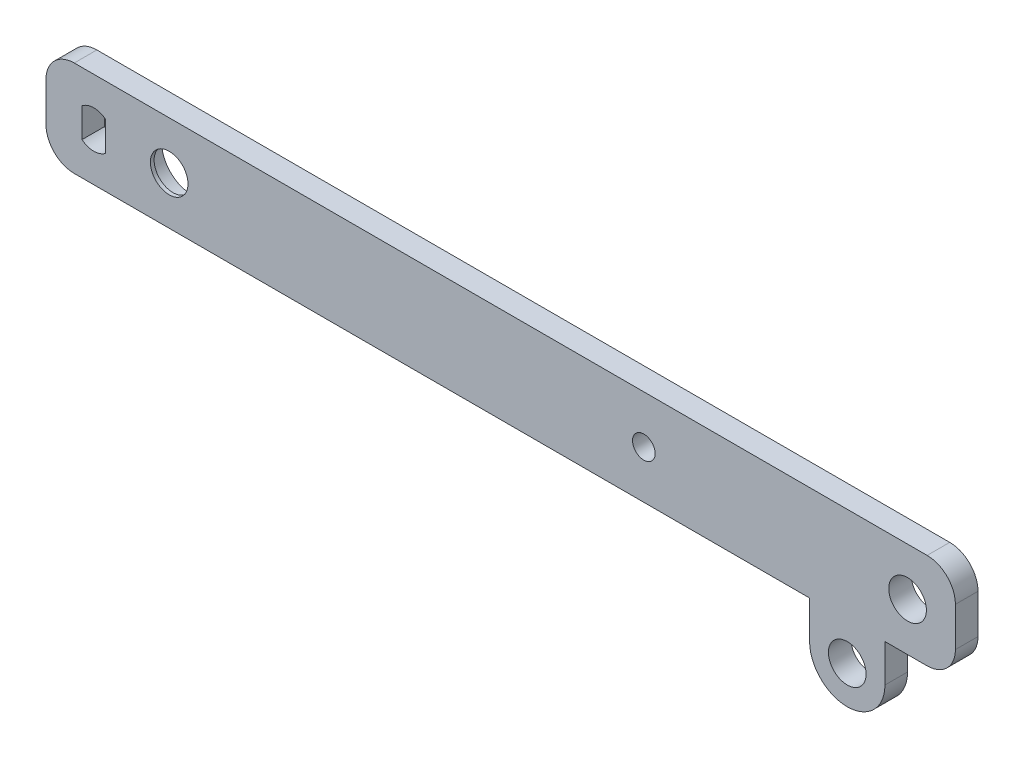
ISO-10303-21;
HEADER;
FILE_DESCRIPTION(('STEP AP214'),'2;1');
FILE_NAME('part.step','',(''),(''),'','','');
FILE_SCHEMA(('AUTOMOTIVE_DESIGN { 1 0 10303 214 1 1 1 1 }'));
ENDSEC;
DATA;
#1=APPLICATION_CONTEXT('core data for automotive mechanical design processes');
#2=APPLICATION_PROTOCOL_DEFINITION('international standard','automotive_design',2000,#1);
#3=PRODUCT_CONTEXT('',#1,'mechanical');
#4=PRODUCT('Part','Part','',(#3));
#5=PRODUCT_RELATED_PRODUCT_CATEGORY('part','',(#4));
#6=PRODUCT_DEFINITION_FORMATION('','',#4);
#7=PRODUCT_DEFINITION_CONTEXT('part definition',#1,'design');
#8=PRODUCT_DEFINITION('design','',#6,#7);
#9=PRODUCT_DEFINITION_SHAPE('','',#8);
#10=(LENGTH_UNIT() NAMED_UNIT(*) SI_UNIT(.MILLI.,.METRE.));
#11=(NAMED_UNIT(*) PLANE_ANGLE_UNIT() SI_UNIT($,.RADIAN.));
#12=(NAMED_UNIT(*) SI_UNIT($,.STERADIAN.) SOLID_ANGLE_UNIT());
#13=UNCERTAINTY_MEASURE_WITH_UNIT(LENGTH_MEASURE(1.E-05),#10,'distance_accuracy_value','');
#14=(GEOMETRIC_REPRESENTATION_CONTEXT(3) GLOBAL_UNCERTAINTY_ASSIGNED_CONTEXT((#13)) GLOBAL_UNIT_ASSIGNED_CONTEXT((#10,
#11,#12)) REPRESENTATION_CONTEXT('',''));
#15=CARTESIAN_POINT('',(0.,0.,0.));
#16=DIRECTION('',(0.,0.,1.));
#17=DIRECTION('',(1.,0.,0.));
#18=AXIS2_PLACEMENT_3D('',#15,#16,#17);
#19=CARTESIAN_POINT('',(40.,0.,12.));
#20=DIRECTION('',(0.,0.,-1.));
#21=DIRECTION('',(-1.,0.,0.));
#22=AXIS2_PLACEMENT_3D('',#19,#20,#21);
#23=CYLINDRICAL_SURFACE('',#22,10.);
#24=CARTESIAN_POINT('',(40.,0.,12.));
#25=DIRECTION('',(0.,0.,1.));
#26=DIRECTION('',(1.,0.,0.));
#27=AXIS2_PLACEMENT_3D('',#24,#25,#26);
#28=CIRCLE('',#27,10.);
#29=CARTESIAN_POINT('',(50.,0.,12.));
#30=VERTEX_POINT('',#29);
#31=EDGE_CURVE('E185',#30,#30,#28,.T.);
#32=ORIENTED_EDGE('',*,*,#31,.T.);
#33=EDGE_LOOP('',(#32));
#34=FACE_BOUND('',#33,.T.);
#35=CARTESIAN_POINT('',(40.,0.,10.));
#36=DIRECTION('',(0.,0.,-1.));
#37=DIRECTION('',(-1.,0.,0.));
#38=AXIS2_PLACEMENT_3D('',#35,#36,#37);
#39=CIRCLE('',#38,10.);
#40=CARTESIAN_POINT('',(30.,0.,10.));
#41=VERTEX_POINT('',#40);
#42=EDGE_CURVE('E249',#41,#41,#39,.T.);
#43=ORIENTED_EDGE('',*,*,#42,.T.);
#44=EDGE_LOOP('',(#43));
#45=FACE_BOUND('',#44,.T.);
#46=ADVANCED_FACE('F34',(#34,#45),#23,.F.);
#47=CARTESIAN_POINT('',(400.,-45.4,12.));
#48=DIRECTION('',(0.,0.,1.));
#49=DIRECTION('',(1.,0.,0.));
#50=AXIS2_PLACEMENT_3D('',#47,#48,#49);
#51=PLANE('',#50);
#52=CARTESIAN_POINT('',(292.,0.,12.));
#53=DIRECTION('',(0.,0.,1.));
#54=DIRECTION('',(1.,0.,0.));
#55=AXIS2_PLACEMENT_3D('',#52,#53,#54);
#56=CIRCLE('',#55,5.99999999999999);
#57=CARTESIAN_POINT('',(298.,0.,12.));
#58=VERTEX_POINT('',#57);
#59=EDGE_CURVE('E579',#58,#58,#56,.T.);
#60=ORIENTED_EDGE('',*,*,#59,.F.);
#61=EDGE_LOOP('',(#60));
#62=FACE_BOUND('',#61,.T.);
#63=DIRECTION('',(0.,-1.,0.));
#64=VECTOR('',#63,1.);
#65=CARTESIAN_POINT('',(-6.28,-7.7821333835909,12.));
#66=LINE('',#65,#64);
#67=CARTESIAN_POINT('',(-6.28,7.7821333835909,12.));
#68=VERTEX_POINT('',#67);
#69=CARTESIAN_POINT('',(-6.28000000000001,-7.7821333835909,12.));
#70=VERTEX_POINT('',#69);
#71=EDGE_CURVE('E161',#68,#70,#66,.T.);
#72=ORIENTED_EDGE('',*,*,#71,.F.);
#73=CARTESIAN_POINT('',(0.,0.,12.));
#74=DIRECTION('',(0.,0.,1.));
#75=DIRECTION('',(1.,0.,0.));
#76=AXIS2_PLACEMENT_3D('',#73,#74,#75);
#77=CIRCLE('',#76,10.);
#78=CARTESIAN_POINT('',(6.28,7.7821333835909,12.));
#79=VERTEX_POINT('',#78);
#80=EDGE_CURVE('E151',#79,#68,#77,.T.);
#81=ORIENTED_EDGE('',*,*,#80,.F.);
#82=DIRECTION('',(0.,1.,0.));
#83=VECTOR('',#82,1.);
#84=CARTESIAN_POINT('',(6.28,-7.7821333835909,12.));
#85=LINE('',#84,#83);
#86=CARTESIAN_POINT('',(6.28000000000001,-7.7821333835909,12.));
#87=VERTEX_POINT('',#86);
#88=EDGE_CURVE('E178',#87,#79,#85,.T.);
#89=ORIENTED_EDGE('',*,*,#88,.F.);
#90=CARTESIAN_POINT('',(0.,0.,12.));
#91=DIRECTION('',(0.,0.,1.));
#92=DIRECTION('',(1.,0.,0.));
#93=AXIS2_PLACEMENT_3D('',#90,#91,#92);
#94=CIRCLE('',#93,10.);
#95=EDGE_CURVE('E176',#70,#87,#94,.T.);
#96=ORIENTED_EDGE('',*,*,#95,.F.);
#97=EDGE_LOOP('',(#72,#81,#89,#96));
#98=FACE_BOUND('',#97,.T.);
#99=CARTESIAN_POINT('',(432.,0.,12.));
#100=DIRECTION('',(0.,0.,1.));
#101=DIRECTION('',(1.,0.,0.));
#102=AXIS2_PLACEMENT_3D('',#99,#100,#101);
#103=CIRCLE('',#102,10.);
#104=CARTESIAN_POINT('',(442.,0.,12.));
#105=VERTEX_POINT('',#104);
#106=EDGE_CURVE('E196',#105,#105,#103,.T.);
#107=ORIENTED_EDGE('',*,*,#106,.F.);
#108=EDGE_LOOP('',(#107));
#109=FACE_BOUND('',#108,.T.);
#110=DIRECTION('',(1.,0.,0.));
#111=VECTOR('',#110,1.);
#112=CARTESIAN_POINT('',(420.,-25.4,12.));
#113=LINE('',#112,#111);
#114=CARTESIAN_POINT('',(420.,-25.4,12.));
#115=VERTEX_POINT('',#114);
#116=CARTESIAN_POINT('',(442.4,-25.4,12.));
#117=VERTEX_POINT('',#116);
#118=EDGE_CURVE('E214',#115,#117,#113,.T.);
#119=ORIENTED_EDGE('',*,*,#118,.T.);
#120=CARTESIAN_POINT('',(442.4,-10.4,12.));
#121=DIRECTION('',(0.,0.,1.));
#122=DIRECTION('',(1.,0.,0.));
#123=AXIS2_PLACEMENT_3D('',#120,#121,#122);
#124=CIRCLE('',#123,15.);
#125=CARTESIAN_POINT('',(457.4,-10.4,12.));
#126=VERTEX_POINT('',#125);
#127=EDGE_CURVE('E42',#117,#126,#124,.T.);
#128=ORIENTED_EDGE('',*,*,#127,.T.);
#129=DIRECTION('',(0.,1.,0.));
#130=VECTOR('',#129,1.);
#131=CARTESIAN_POINT('',(457.4,25.4,12.));
#132=LINE('',#131,#130);
#133=CARTESIAN_POINT('',(457.4,10.4,12.));
#134=VERTEX_POINT('',#133);
#135=EDGE_CURVE('E216',#126,#134,#132,.T.);
#136=ORIENTED_EDGE('',*,*,#135,.T.);
#137=CARTESIAN_POINT('',(442.4,10.4,12.));
#138=DIRECTION('',(0.,0.,1.));
#139=DIRECTION('',(1.,0.,0.));
#140=AXIS2_PLACEMENT_3D('',#137,#138,#139);
#141=CIRCLE('',#140,15.);
#142=CARTESIAN_POINT('',(442.4,25.4,12.));
#143=VERTEX_POINT('',#142);
#144=EDGE_CURVE('E49',#134,#143,#141,.T.);
#145=ORIENTED_EDGE('',*,*,#144,.T.);
#146=DIRECTION('',(-1.,0.,0.));
#147=VECTOR('',#146,1.);
#148=CARTESIAN_POINT('',(-25.4,25.4,12.));
#149=LINE('',#148,#147);
#150=CARTESIAN_POINT('',(-10.4,25.4,12.));
#151=VERTEX_POINT('',#150);
#152=EDGE_CURVE('E218',#143,#151,#149,.T.);
#153=ORIENTED_EDGE('',*,*,#152,.T.);
#154=CARTESIAN_POINT('',(-10.4,10.4,12.));
#155=DIRECTION('',(0.,0.,1.));
#156=DIRECTION('',(1.,0.,0.));
#157=AXIS2_PLACEMENT_3D('',#154,#155,#156);
#158=CIRCLE('',#157,15.);
#159=CARTESIAN_POINT('',(-25.4,10.4,12.));
#160=VERTEX_POINT('',#159);
#161=EDGE_CURVE('E266',#151,#160,#158,.T.);
#162=ORIENTED_EDGE('',*,*,#161,.T.);
#163=DIRECTION('',(0.,-1.,0.));
#164=VECTOR('',#163,1.);
#165=CARTESIAN_POINT('',(-25.4,25.4,12.));
#166=LINE('',#165,#164);
#167=CARTESIAN_POINT('',(-25.4,-10.4,12.));
#168=VERTEX_POINT('',#167);
#169=EDGE_CURVE('E202',#160,#168,#166,.T.);
#170=ORIENTED_EDGE('',*,*,#169,.T.);
#171=CARTESIAN_POINT('',(-10.4,-10.4,12.));
#172=DIRECTION('',(0.,0.,1.));
#173=DIRECTION('',(1.,0.,0.));
#174=AXIS2_PLACEMENT_3D('',#171,#172,#173);
#175=CIRCLE('',#174,15.);
#176=CARTESIAN_POINT('',(-10.4,-25.4,12.));
#177=VERTEX_POINT('',#176);
#178=EDGE_CURVE('E268',#168,#177,#175,.T.);
#179=ORIENTED_EDGE('',*,*,#178,.T.);
#180=DIRECTION('',(1.,0.,0.));
#181=VECTOR('',#180,1.);
#182=CARTESIAN_POINT('',(-25.4,-25.4,12.));
#183=LINE('',#182,#181);
#184=CARTESIAN_POINT('',(380.,-25.4,12.));
#185=VERTEX_POINT('',#184);
#186=EDGE_CURVE('E205',#177,#185,#183,.T.);
#187=ORIENTED_EDGE('',*,*,#186,.T.);
#188=DIRECTION('',(0.,-1.,0.));
#189=VECTOR('',#188,1.);
#190=CARTESIAN_POINT('',(380.,-45.4,12.));
#191=LINE('',#190,#189);
#192=CARTESIAN_POINT('',(380.,-45.4,12.));
#193=VERTEX_POINT('',#192);
#194=EDGE_CURVE('E208',#185,#193,#191,.T.);
#195=ORIENTED_EDGE('',*,*,#194,.T.);
#196=CARTESIAN_POINT('',(400.,-45.4,12.));
#197=DIRECTION('',(0.,0.,1.));
#198=DIRECTION('',(1.,0.,0.));
#199=AXIS2_PLACEMENT_3D('',#196,#197,#198);
#200=CIRCLE('',#199,20.);
#201=CARTESIAN_POINT('',(420.,-45.4,12.));
#202=VERTEX_POINT('',#201);
#203=EDGE_CURVE('E210',#193,#202,#200,.T.);
#204=ORIENTED_EDGE('',*,*,#203,.T.);
#205=DIRECTION('',(0.,1.,0.));
#206=VECTOR('',#205,1.);
#207=CARTESIAN_POINT('',(420.,-45.4,12.));
#208=LINE('',#207,#206);
#209=EDGE_CURVE('E212',#202,#115,#208,.T.);
#210=ORIENTED_EDGE('',*,*,#209,.T.);
#211=EDGE_LOOP('',(#119,#128,#136,#145,#153,#162,#170,#179,#187,#195,#204,#210));
#212=FACE_BOUND('',#211,.T.);
#213=ORIENTED_EDGE('',*,*,#31,.F.);
#214=EDGE_LOOP('',(#213));
#215=FACE_BOUND('',#214,.T.);
#216=CARTESIAN_POINT('',(400.,-45.4,12.));
#217=DIRECTION('',(0.,0.,1.));
#218=DIRECTION('',(1.,0.,0.));
#219=AXIS2_PLACEMENT_3D('',#216,#217,#218);
#220=CIRCLE('',#219,9.99999999999998);
#221=CARTESIAN_POINT('',(410.,-45.4,12.));
#222=VERTEX_POINT('',#221);
#223=EDGE_CURVE('E573',#222,#222,#220,.T.);
#224=ORIENTED_EDGE('',*,*,#223,.F.);
#225=EDGE_LOOP('',(#224));
#226=FACE_BOUND('',#225,.T.);
#227=ADVANCED_FACE('F173',(#62,#98,#109,#212,#215,#226),#51,.T.);
#228=CARTESIAN_POINT('',(400.,-45.4,0.));
#229=DIRECTION('',(0.,0.,1.));
#230=DIRECTION('',(1.,0.,0.));
#231=AXIS2_PLACEMENT_3D('',#228,#229,#230);
#232=PLANE('',#231);
#233=CARTESIAN_POINT('',(40.,0.,0.));
#234=DIRECTION('',(0.,0.,-1.));
#235=DIRECTION('',(-1.,0.,0.));
#236=AXIS2_PLACEMENT_3D('',#233,#234,#235);
#237=CIRCLE('',#236,16.);
#238=CARTESIAN_POINT('',(24.,0.,0.));
#239=VERTEX_POINT('',#238);
#240=EDGE_CURVE('E562',#239,#239,#237,.T.);
#241=ORIENTED_EDGE('',*,*,#240,.F.);
#242=EDGE_LOOP('',(#241));
#243=FACE_BOUND('',#242,.T.);
#244=CARTESIAN_POINT('',(66.4370013321474,-11.2982209536767,0.));
#245=DIRECTION('',(0.,0.,-1.));
#246=DIRECTION('',(-1.,0.,0.));
#247=AXIS2_PLACEMENT_3D('',#244,#245,#246);
#248=CIRCLE('',#247,2.14495620677024);
#249=CARTESIAN_POINT('',(64.2920451253771,-11.2982209536767,0.));
#250=VERTEX_POINT('',#249);
#251=EDGE_CURVE('E252',#250,#250,#248,.T.);
#252=ORIENTED_EDGE('',*,*,#251,.F.);
#253=EDGE_LOOP('',(#252));
#254=FACE_BOUND('',#253,.T.);
#255=CARTESIAN_POINT('',(432.,0.,0.));
#256=DIRECTION('',(0.,0.,1.));
#257=DIRECTION('',(1.,0.,0.));
#258=AXIS2_PLACEMENT_3D('',#255,#256,#257);
#259=CIRCLE('',#258,10.);
#260=CARTESIAN_POINT('',(442.,0.,0.));
#261=VERTEX_POINT('',#260);
#262=EDGE_CURVE('E169',#261,#261,#259,.T.);
#263=ORIENTED_EDGE('',*,*,#262,.T.);
#264=EDGE_LOOP('',(#263));
#265=FACE_BOUND('',#264,.T.);
#266=DIRECTION('',(0.,1.,0.));
#267=VECTOR('',#266,1.);
#268=CARTESIAN_POINT('',(457.4,25.4,0.));
#269=LINE('',#268,#267);
#270=CARTESIAN_POINT('',(457.4,-10.4,0.));
#271=VERTEX_POINT('',#270);
#272=CARTESIAN_POINT('',(457.4,10.4,0.));
#273=VERTEX_POINT('',#272);
#274=EDGE_CURVE('E233',#271,#273,#269,.T.);
#275=ORIENTED_EDGE('',*,*,#274,.F.);
#276=CARTESIAN_POINT('',(442.4,-10.4,0.));
#277=DIRECTION('',(0.,0.,1.));
#278=DIRECTION('',(1.,0.,0.));
#279=AXIS2_PLACEMENT_3D('',#276,#277,#278);
#280=CIRCLE('',#279,15.);
#281=CARTESIAN_POINT('',(442.4,-25.4,0.));
#282=VERTEX_POINT('',#281);
#283=EDGE_CURVE('E280',#271,#282,#280,.F.);
#284=ORIENTED_EDGE('',*,*,#283,.T.);
#285=DIRECTION('',(1.,0.,0.));
#286=VECTOR('',#285,1.);
#287=CARTESIAN_POINT('',(420.,-25.4,0.));
#288=LINE('',#287,#286);
#289=CARTESIAN_POINT('',(420.,-25.4,0.));
#290=VERTEX_POINT('',#289);
#291=EDGE_CURVE('E231',#290,#282,#288,.T.);
#292=ORIENTED_EDGE('',*,*,#291,.F.);
#293=DIRECTION('',(0.,1.,0.));
#294=VECTOR('',#293,1.);
#295=CARTESIAN_POINT('',(420.,-45.4,0.));
#296=LINE('',#295,#294);
#297=CARTESIAN_POINT('',(420.,-45.4,0.));
#298=VERTEX_POINT('',#297);
#299=EDGE_CURVE('E229',#298,#290,#296,.T.);
#300=ORIENTED_EDGE('',*,*,#299,.F.);
#301=CARTESIAN_POINT('',(400.,-45.4,0.));
#302=DIRECTION('',(0.,0.,1.));
#303=DIRECTION('',(1.,0.,0.));
#304=AXIS2_PLACEMENT_3D('',#301,#302,#303);
#305=CIRCLE('',#304,20.);
#306=CARTESIAN_POINT('',(380.,-45.4,0.));
#307=VERTEX_POINT('',#306);
#308=EDGE_CURVE('E227',#307,#298,#305,.T.);
#309=ORIENTED_EDGE('',*,*,#308,.F.);
#310=DIRECTION('',(0.,-1.,0.));
#311=VECTOR('',#310,1.);
#312=CARTESIAN_POINT('',(380.,-45.4,0.));
#313=LINE('',#312,#311);
#314=CARTESIAN_POINT('',(380.,-25.4,0.));
#315=VERTEX_POINT('',#314);
#316=EDGE_CURVE('E225',#315,#307,#313,.T.);
#317=ORIENTED_EDGE('',*,*,#316,.F.);
#318=DIRECTION('',(1.,0.,0.));
#319=VECTOR('',#318,1.);
#320=CARTESIAN_POINT('',(-25.4,-25.4,0.));
#321=LINE('',#320,#319);
#322=CARTESIAN_POINT('',(-10.4,-25.4,0.));
#323=VERTEX_POINT('',#322);
#324=EDGE_CURVE('E223',#323,#315,#321,.T.);
#325=ORIENTED_EDGE('',*,*,#324,.F.);
#326=CARTESIAN_POINT('',(-10.4,-10.4,0.));
#327=DIRECTION('',(0.,0.,1.));
#328=DIRECTION('',(1.,0.,0.));
#329=AXIS2_PLACEMENT_3D('',#326,#327,#328);
#330=CIRCLE('',#329,15.);
#331=CARTESIAN_POINT('',(-25.4,-10.4,0.));
#332=VERTEX_POINT('',#331);
#333=EDGE_CURVE('E259',#323,#332,#330,.F.);
#334=ORIENTED_EDGE('',*,*,#333,.T.);
#335=DIRECTION('',(0.,-1.,0.));
#336=VECTOR('',#335,1.);
#337=CARTESIAN_POINT('',(-25.4,25.4,0.));
#338=LINE('',#337,#336);
#339=CARTESIAN_POINT('',(-25.4,10.4,0.));
#340=VERTEX_POINT('',#339);
#341=EDGE_CURVE('E199',#340,#332,#338,.T.);
#342=ORIENTED_EDGE('',*,*,#341,.F.);
#343=CARTESIAN_POINT('',(-10.4,10.4,0.));
#344=DIRECTION('',(0.,0.,1.));
#345=DIRECTION('',(1.,0.,0.));
#346=AXIS2_PLACEMENT_3D('',#343,#344,#345);
#347=CIRCLE('',#346,15.);
#348=CARTESIAN_POINT('',(-10.4,25.4,0.));
#349=VERTEX_POINT('',#348);
#350=EDGE_CURVE('E256',#340,#349,#347,.F.);
#351=ORIENTED_EDGE('',*,*,#350,.T.);
#352=DIRECTION('',(-1.,0.,0.));
#353=VECTOR('',#352,1.);
#354=CARTESIAN_POINT('',(-25.4,25.4,0.));
#355=LINE('',#354,#353);
#356=CARTESIAN_POINT('',(442.4,25.4,0.));
#357=VERTEX_POINT('',#356);
#358=EDGE_CURVE('E206',#357,#349,#355,.T.);
#359=ORIENTED_EDGE('',*,*,#358,.F.);
#360=CARTESIAN_POINT('',(442.4,10.4,0.));
#361=DIRECTION('',(0.,0.,1.));
#362=DIRECTION('',(1.,0.,0.));
#363=AXIS2_PLACEMENT_3D('',#360,#361,#362);
#364=CIRCLE('',#363,15.);
#365=EDGE_CURVE('E278',#357,#273,#364,.F.);
#366=ORIENTED_EDGE('',*,*,#365,.T.);
#367=EDGE_LOOP('',(#275,#284,#292,#300,#309,#317,#325,#334,#342,#351,#359,#366));
#368=FACE_BOUND('',#367,.T.);
#369=CARTESIAN_POINT('',(0.,0.,0.));
#370=DIRECTION('',(0.,0.,1.));
#371=DIRECTION('',(1.,0.,0.));
#372=AXIS2_PLACEMENT_3D('',#369,#370,#371);
#373=CIRCLE('',#372,10.);
#374=CARTESIAN_POINT('',(6.28000000000001,7.7821333835909,0.));
#375=VERTEX_POINT('',#374);
#376=CARTESIAN_POINT('',(-6.28,7.7821333835909,0.));
#377=VERTEX_POINT('',#376);
#378=EDGE_CURVE('E183',#375,#377,#373,.T.);
#379=ORIENTED_EDGE('',*,*,#378,.T.);
#380=DIRECTION('',(0.,-1.,0.));
#381=VECTOR('',#380,1.);
#382=CARTESIAN_POINT('',(-6.28,-7.7821333835909,0.));
#383=LINE('',#382,#381);
#384=CARTESIAN_POINT('',(-6.28000000000001,-7.7821333835909,0.));
#385=VERTEX_POINT('',#384);
#386=EDGE_CURVE('E168',#377,#385,#383,.T.);
#387=ORIENTED_EDGE('',*,*,#386,.T.);
#388=CARTESIAN_POINT('',(0.,0.,0.));
#389=DIRECTION('',(0.,0.,1.));
#390=DIRECTION('',(1.,0.,0.));
#391=AXIS2_PLACEMENT_3D('',#388,#389,#390);
#392=CIRCLE('',#391,10.);
#393=CARTESIAN_POINT('',(6.28,-7.7821333835909,0.));
#394=VERTEX_POINT('',#393);
#395=EDGE_CURVE('E187',#385,#394,#392,.T.);
#396=ORIENTED_EDGE('',*,*,#395,.T.);
#397=DIRECTION('',(0.,1.,0.));
#398=VECTOR('',#397,1.);
#399=CARTESIAN_POINT('',(6.28,-7.7821333835909,0.));
#400=LINE('',#399,#398);
#401=EDGE_CURVE('E162',#394,#375,#400,.T.);
#402=ORIENTED_EDGE('',*,*,#401,.T.);
#403=EDGE_LOOP('',(#379,#387,#396,#402));
#404=FACE_BOUND('',#403,.T.);
#405=CARTESIAN_POINT('',(292.,0.,0.));
#406=DIRECTION('',(0.,0.,1.));
#407=DIRECTION('',(1.,0.,0.));
#408=AXIS2_PLACEMENT_3D('',#405,#406,#407);
#409=CIRCLE('',#408,5.99999999999999);
#410=CARTESIAN_POINT('',(298.,0.,0.));
#411=VERTEX_POINT('',#410);
#412=EDGE_CURVE('E576',#411,#411,#409,.T.);
#413=ORIENTED_EDGE('',*,*,#412,.T.);
#414=EDGE_LOOP('',(#413));
#415=FACE_BOUND('',#414,.T.);
#416=CARTESIAN_POINT('',(400.,-45.4,0.));
#417=DIRECTION('',(0.,0.,1.));
#418=DIRECTION('',(1.,0.,0.));
#419=AXIS2_PLACEMENT_3D('',#416,#417,#418);
#420=CIRCLE('',#419,9.99999999999998);
#421=CARTESIAN_POINT('',(410.,-45.4,0.));
#422=VERTEX_POINT('',#421);
#423=EDGE_CURVE('E570',#422,#422,#420,.T.);
#424=ORIENTED_EDGE('',*,*,#423,.T.);
#425=EDGE_LOOP('',(#424));
#426=FACE_BOUND('',#425,.T.);
#427=ADVANCED_FACE('F295',(#243,#254,#265,#368,#404,#415,#426),#232,.F.);
#428=CARTESIAN_POINT('',(-25.4,25.4,12.));
#429=DIRECTION('',(1.,0.,0.));
#430=DIRECTION('',(0.,1.,0.));
#431=AXIS2_PLACEMENT_3D('',#428,#429,#430);
#432=PLANE('',#431);
#433=ORIENTED_EDGE('',*,*,#341,.T.);
#434=DIRECTION('',(0.,0.,-1.));
#435=VECTOR('',#434,1.);
#436=CARTESIAN_POINT('',(-25.4,-10.4,12.));
#437=LINE('',#436,#435);
#438=EDGE_CURVE('E264',#332,#168,#437,.F.);
#439=ORIENTED_EDGE('',*,*,#438,.T.);
#440=ORIENTED_EDGE('',*,*,#169,.F.);
#441=DIRECTION('',(0.,0.,-1.));
#442=VECTOR('',#441,1.);
#443=CARTESIAN_POINT('',(-25.4,10.4,12.));
#444=LINE('',#443,#442);
#445=EDGE_CURVE('E261',#160,#340,#444,.T.);
#446=ORIENTED_EDGE('',*,*,#445,.T.);
#447=EDGE_LOOP('',(#433,#439,#440,#446));
#448=FACE_BOUND('',#447,.T.);
#449=ADVANCED_FACE('F323',(#448),#432,.F.);
#450=CARTESIAN_POINT('',(-25.4,-25.4,12.));
#451=DIRECTION('',(0.,1.,0.));
#452=DIRECTION('',(0.,0.,1.));
#453=AXIS2_PLACEMENT_3D('',#450,#451,#452);
#454=PLANE('',#453);
#455=ORIENTED_EDGE('',*,*,#186,.F.);
#456=DIRECTION('',(0.,0.,-1.));
#457=VECTOR('',#456,1.);
#458=CARTESIAN_POINT('',(-10.4,-25.4,12.));
#459=LINE('',#458,#457);
#460=EDGE_CURVE('E248',#177,#323,#459,.T.);
#461=ORIENTED_EDGE('',*,*,#460,.T.);
#462=ORIENTED_EDGE('',*,*,#324,.T.);
#463=DIRECTION('',(0.,0.,-1.));
#464=VECTOR('',#463,1.);
#465=CARTESIAN_POINT('',(380.,-25.4,12.));
#466=LINE('',#465,#464);
#467=EDGE_CURVE('E245',#185,#315,#466,.T.);
#468=ORIENTED_EDGE('',*,*,#467,.F.);
#469=EDGE_LOOP('',(#455,#461,#462,#468));
#470=FACE_BOUND('',#469,.T.);
#471=ADVANCED_FACE('F317',(#470),#454,.F.);
#472=CARTESIAN_POINT('',(380.,-45.4,12.));
#473=DIRECTION('',(1.,0.,0.));
#474=DIRECTION('',(0.,0.,-1.));
#475=AXIS2_PLACEMENT_3D('',#472,#473,#474);
#476=PLANE('',#475);
#477=ORIENTED_EDGE('',*,*,#316,.T.);
#478=DIRECTION('',(0.,0.,-1.));
#479=VECTOR('',#478,1.);
#480=CARTESIAN_POINT('',(380.,-45.4,12.));
#481=LINE('',#480,#479);
#482=EDGE_CURVE('E242',#193,#307,#481,.T.);
#483=ORIENTED_EDGE('',*,*,#482,.F.);
#484=ORIENTED_EDGE('',*,*,#194,.F.);
#485=ORIENTED_EDGE('',*,*,#467,.T.);
#486=EDGE_LOOP('',(#477,#483,#484,#485));
#487=FACE_BOUND('',#486,.T.);
#488=ADVANCED_FACE('F313',(#487),#476,.F.);
#489=CARTESIAN_POINT('',(400.,-45.4,12.));
#490=DIRECTION('',(0.,0.,-1.));
#491=DIRECTION('',(-1.,0.,0.));
#492=AXIS2_PLACEMENT_3D('',#489,#490,#491);
#493=CYLINDRICAL_SURFACE('',#492,20.);
#494=ORIENTED_EDGE('',*,*,#308,.T.);
#495=DIRECTION('',(0.,0.,-1.));
#496=VECTOR('',#495,1.);
#497=CARTESIAN_POINT('',(420.,-45.4,12.));
#498=LINE('',#497,#496);
#499=EDGE_CURVE('E239',#202,#298,#498,.T.);
#500=ORIENTED_EDGE('',*,*,#499,.F.);
#501=ORIENTED_EDGE('',*,*,#203,.F.);
#502=ORIENTED_EDGE('',*,*,#482,.T.);
#503=EDGE_LOOP('',(#494,#500,#501,#502));
#504=FACE_BOUND('',#503,.T.);
#505=ADVANCED_FACE('F308',(#504),#493,.T.);
#506=CARTESIAN_POINT('',(420.,-45.4,12.));
#507=DIRECTION('',(-1.,0.,0.));
#508=DIRECTION('',(0.,0.,1.));
#509=AXIS2_PLACEMENT_3D('',#506,#507,#508);
#510=PLANE('',#509);
#511=ORIENTED_EDGE('',*,*,#299,.T.);
#512=DIRECTION('',(0.,0.,-1.));
#513=VECTOR('',#512,1.);
#514=CARTESIAN_POINT('',(420.,-25.4,12.));
#515=LINE('',#514,#513);
#516=EDGE_CURVE('E220',#115,#290,#515,.T.);
#517=ORIENTED_EDGE('',*,*,#516,.F.);
#518=ORIENTED_EDGE('',*,*,#209,.F.);
#519=ORIENTED_EDGE('',*,*,#499,.T.);
#520=EDGE_LOOP('',(#511,#517,#518,#519));
#521=FACE_BOUND('',#520,.T.);
#522=ADVANCED_FACE('F302',(#521),#510,.F.);
#523=CARTESIAN_POINT('',(420.,-25.4,12.));
#524=DIRECTION('',(0.,1.,0.));
#525=DIRECTION('',(0.,0.,1.));
#526=AXIS2_PLACEMENT_3D('',#523,#524,#525);
#527=PLANE('',#526);
#528=ORIENTED_EDGE('',*,*,#291,.T.);
#529=DIRECTION('',(0.,0.,-1.));
#530=VECTOR('',#529,1.);
#531=CARTESIAN_POINT('',(442.4,-25.4,12.));
#532=LINE('',#531,#530);
#533=EDGE_CURVE('E57',#282,#117,#532,.F.);
#534=ORIENTED_EDGE('',*,*,#533,.T.);
#535=ORIENTED_EDGE('',*,*,#118,.F.);
#536=ORIENTED_EDGE('',*,*,#516,.T.);
#537=EDGE_LOOP('',(#528,#534,#535,#536));
#538=FACE_BOUND('',#537,.T.);
#539=ADVANCED_FACE('F298',(#538),#527,.F.);
#540=CARTESIAN_POINT('',(457.4,25.4,12.));
#541=DIRECTION('',(-1.,0.,0.));
#542=DIRECTION('',(0.,0.,1.));
#543=AXIS2_PLACEMENT_3D('',#540,#541,#542);
#544=PLANE('',#543);
#545=ORIENTED_EDGE('',*,*,#135,.F.);
#546=DIRECTION('',(0.,0.,-1.));
#547=VECTOR('',#546,1.);
#548=CARTESIAN_POINT('',(457.4,-10.4,12.));
#549=LINE('',#548,#547);
#550=EDGE_CURVE('E275',#126,#271,#549,.T.);
#551=ORIENTED_EDGE('',*,*,#550,.T.);
#552=ORIENTED_EDGE('',*,*,#274,.T.);
#553=DIRECTION('',(0.,0.,-1.));
#554=VECTOR('',#553,1.);
#555=CARTESIAN_POINT('',(457.4,10.4,12.));
#556=LINE('',#555,#554);
#557=EDGE_CURVE('E273',#273,#134,#556,.F.);
#558=ORIENTED_EDGE('',*,*,#557,.T.);
#559=EDGE_LOOP('',(#545,#551,#552,#558));
#560=FACE_BOUND('',#559,.T.);
#561=ADVANCED_FACE('F289',(#560),#544,.F.);
#562=CARTESIAN_POINT('',(-25.4,25.4,12.));
#563=DIRECTION('',(0.,-1.,0.));
#564=DIRECTION('',(0.,0.,-1.));
#565=AXIS2_PLACEMENT_3D('',#562,#563,#564);
#566=PLANE('',#565);
#567=ORIENTED_EDGE('',*,*,#152,.F.);
#568=DIRECTION('',(0.,0.,-1.));
#569=VECTOR('',#568,1.);
#570=CARTESIAN_POINT('',(442.4,25.4,12.));
#571=LINE('',#570,#569);
#572=EDGE_CURVE('E11',#143,#357,#571,.T.);
#573=ORIENTED_EDGE('',*,*,#572,.T.);
#574=ORIENTED_EDGE('',*,*,#358,.T.);
#575=DIRECTION('',(0.,0.,-1.));
#576=VECTOR('',#575,1.);
#577=CARTESIAN_POINT('',(-10.4,25.4,12.));
#578=LINE('',#577,#576);
#579=EDGE_CURVE('E270',#349,#151,#578,.F.);
#580=ORIENTED_EDGE('',*,*,#579,.T.);
#581=EDGE_LOOP('',(#567,#573,#574,#580));
#582=FACE_BOUND('',#581,.T.);
#583=ADVANCED_FACE('F334',(#582),#566,.F.);
#584=CARTESIAN_POINT('',(432.,0.,12.));
#585=DIRECTION('',(0.,0.,-1.));
#586=DIRECTION('',(-1.,0.,0.));
#587=AXIS2_PLACEMENT_3D('',#584,#585,#586);
#588=CYLINDRICAL_SURFACE('',#587,10.);
#589=ORIENTED_EDGE('',*,*,#106,.T.);
#590=EDGE_LOOP('',(#589));
#591=FACE_BOUND('',#590,.T.);
#592=ORIENTED_EDGE('',*,*,#262,.F.);
#593=EDGE_LOOP('',(#592));
#594=FACE_BOUND('',#593,.T.);
#595=ADVANCED_FACE('F367',(#591,#594),#588,.F.);
#596=CARTESIAN_POINT('',(0.,0.,12.));
#597=DIRECTION('',(0.,0.,-1.));
#598=DIRECTION('',(-1.,0.,0.));
#599=AXIS2_PLACEMENT_3D('',#596,#597,#598);
#600=CYLINDRICAL_SURFACE('',#599,10.);
#601=ORIENTED_EDGE('',*,*,#378,.F.);
#602=DIRECTION('',(0.,0.,-1.));
#603=VECTOR('',#602,1.);
#604=CARTESIAN_POINT('',(6.28,7.7821333835909,12.));
#605=LINE('',#604,#603);
#606=EDGE_CURVE('E157',#79,#375,#605,.T.);
#607=ORIENTED_EDGE('',*,*,#606,.F.);
#608=ORIENTED_EDGE('',*,*,#80,.T.);
#609=DIRECTION('',(0.,0.,-1.));
#610=VECTOR('',#609,1.);
#611=CARTESIAN_POINT('',(-6.28,7.7821333835909,12.));
#612=LINE('',#611,#610);
#613=EDGE_CURVE('E154',#68,#377,#612,.T.);
#614=ORIENTED_EDGE('',*,*,#613,.T.);
#615=EDGE_LOOP('',(#601,#607,#608,#614));
#616=FACE_BOUND('',#615,.T.);
#617=ADVANCED_FACE('F153',(#616),#600,.F.);
#618=CARTESIAN_POINT('',(-6.28,-7.7821333835909,12.));
#619=DIRECTION('',(1.,0.,0.));
#620=DIRECTION('',(0.,0.,-1.));
#621=AXIS2_PLACEMENT_3D('',#618,#619,#620);
#622=PLANE('',#621);
#623=ORIENTED_EDGE('',*,*,#386,.F.);
#624=ORIENTED_EDGE('',*,*,#613,.F.);
#625=ORIENTED_EDGE('',*,*,#71,.T.);
#626=DIRECTION('',(0.,0.,-1.));
#627=VECTOR('',#626,1.);
#628=CARTESIAN_POINT('',(-6.28000000000001,-7.7821333835909,12.));
#629=LINE('',#628,#627);
#630=EDGE_CURVE('E170',#70,#385,#629,.T.);
#631=ORIENTED_EDGE('',*,*,#630,.T.);
#632=EDGE_LOOP('',(#623,#624,#625,#631));
#633=FACE_BOUND('',#632,.T.);
#634=ADVANCED_FACE('F165',(#633),#622,.T.);
#635=CARTESIAN_POINT('',(0.,0.,12.));
#636=DIRECTION('',(0.,0.,-1.));
#637=DIRECTION('',(-1.,0.,0.));
#638=AXIS2_PLACEMENT_3D('',#635,#636,#637);
#639=CYLINDRICAL_SURFACE('',#638,10.);
#640=ORIENTED_EDGE('',*,*,#395,.F.);
#641=ORIENTED_EDGE('',*,*,#630,.F.);
#642=ORIENTED_EDGE('',*,*,#95,.T.);
#643=DIRECTION('',(0.,0.,-1.));
#644=VECTOR('',#643,1.);
#645=CARTESIAN_POINT('',(6.28,-7.7821333835909,12.));
#646=LINE('',#645,#644);
#647=EDGE_CURVE('E193',#87,#394,#646,.T.);
#648=ORIENTED_EDGE('',*,*,#647,.T.);
#649=EDGE_LOOP('',(#640,#641,#642,#648));
#650=FACE_BOUND('',#649,.T.);
#651=ADVANCED_FACE('F358',(#650),#639,.F.);
#652=CARTESIAN_POINT('',(6.28,-7.7821333835909,12.));
#653=DIRECTION('',(-1.,0.,0.));
#654=DIRECTION('',(0.,0.,1.));
#655=AXIS2_PLACEMENT_3D('',#652,#653,#654);
#656=PLANE('',#655);
#657=ORIENTED_EDGE('',*,*,#401,.F.);
#658=ORIENTED_EDGE('',*,*,#647,.F.);
#659=ORIENTED_EDGE('',*,*,#88,.T.);
#660=ORIENTED_EDGE('',*,*,#606,.T.);
#661=EDGE_LOOP('',(#657,#658,#659,#660));
#662=FACE_BOUND('',#661,.T.);
#663=ADVANCED_FACE('F355',(#662),#656,.T.);
#664=CARTESIAN_POINT('',(292.,0.,12.));
#665=DIRECTION('',(0.,0.,-1.));
#666=DIRECTION('',(-1.,0.,0.));
#667=AXIS2_PLACEMENT_3D('',#664,#665,#666);
#668=CYLINDRICAL_SURFACE('',#667,5.99999999999999);
#669=ORIENTED_EDGE('',*,*,#59,.T.);
#670=EDGE_LOOP('',(#669));
#671=FACE_BOUND('',#670,.T.);
#672=ORIENTED_EDGE('',*,*,#412,.F.);
#673=EDGE_LOOP('',(#672));
#674=FACE_BOUND('',#673,.T.);
#675=ADVANCED_FACE('F353',(#671,#674),#668,.F.);
#676=CARTESIAN_POINT('',(400.,-45.4,12.));
#677=DIRECTION('',(0.,0.,-1.));
#678=DIRECTION('',(-1.,0.,0.));
#679=AXIS2_PLACEMENT_3D('',#676,#677,#678);
#680=CYLINDRICAL_SURFACE('',#679,9.99999999999998);
#681=ORIENTED_EDGE('',*,*,#223,.T.);
#682=EDGE_LOOP('',(#681));
#683=FACE_BOUND('',#682,.T.);
#684=ORIENTED_EDGE('',*,*,#423,.F.);
#685=EDGE_LOOP('',(#684));
#686=FACE_BOUND('',#685,.T.);
#687=ADVANCED_FACE('F499',(#683,#686),#680,.F.);
#688=CARTESIAN_POINT('',(66.4370013321474,-11.2982209536767,3.));
#689=DIRECTION('',(0.,0.,-1.));
#690=DIRECTION('',(-1.,0.,0.));
#691=AXIS2_PLACEMENT_3D('',#688,#689,#690);
#692=CYLINDRICAL_SURFACE('',#691,2.14495620677024);
#693=CARTESIAN_POINT('',(66.4370013321474,-11.2982209536767,3.));
#694=DIRECTION('',(0.,0.,-1.));
#695=DIRECTION('',(-1.,0.,0.));
#696=AXIS2_PLACEMENT_3D('',#693,#694,#695);
#697=CIRCLE('',#696,2.14495620677024);
#698=CARTESIAN_POINT('',(64.2920451253771,-11.2982209536767,3.));
#699=VERTEX_POINT('',#698);
#700=EDGE_CURVE('E567',#699,#699,#697,.T.);
#701=ORIENTED_EDGE('',*,*,#700,.F.);
#702=EDGE_LOOP('',(#701));
#703=FACE_BOUND('',#702,.T.);
#704=ORIENTED_EDGE('',*,*,#251,.T.);
#705=EDGE_LOOP('',(#704));
#706=FACE_BOUND('',#705,.T.);
#707=ADVANCED_FACE('F508',(#703,#706),#692,.F.);
#708=CARTESIAN_POINT('',(66.4370013321474,-11.2982209536767,3.));
#709=DIRECTION('',(0.,0.,-1.));
#710=DIRECTION('',(-1.,0.,0.));
#711=AXIS2_PLACEMENT_3D('',#708,#709,#710);
#712=PLANE('',#711);
#713=ORIENTED_EDGE('',*,*,#700,.T.);
#714=EDGE_LOOP('',(#713));
#715=FACE_BOUND('',#714,.T.);
#716=ADVANCED_FACE('F517',(#715),#712,.T.);
#717=CARTESIAN_POINT('',(40.,0.,10.));
#718=DIRECTION('',(0.,0.,-1.));
#719=DIRECTION('',(-1.,0.,0.));
#720=AXIS2_PLACEMENT_3D('',#717,#718,#719);
#721=CYLINDRICAL_SURFACE('',#720,16.);
#722=CARTESIAN_POINT('',(40.,0.,10.));
#723=DIRECTION('',(0.,0.,-1.));
#724=DIRECTION('',(-1.,0.,0.));
#725=AXIS2_PLACEMENT_3D('',#722,#723,#724);
#726=CIRCLE('',#725,16.);
#727=CARTESIAN_POINT('',(24.,0.,10.));
#728=VERTEX_POINT('',#727);
#729=EDGE_CURVE('E253',#728,#728,#726,.T.);
#730=ORIENTED_EDGE('',*,*,#729,.F.);
#731=EDGE_LOOP('',(#730));
#732=FACE_BOUND('',#731,.T.);
#733=ORIENTED_EDGE('',*,*,#240,.T.);
#734=EDGE_LOOP('',(#733));
#735=FACE_BOUND('',#734,.T.);
#736=ADVANCED_FACE('F526',(#732,#735),#721,.F.);
#737=CARTESIAN_POINT('',(40.,0.,10.));
#738=DIRECTION('',(0.,0.,-1.));
#739=DIRECTION('',(-1.,0.,0.));
#740=AXIS2_PLACEMENT_3D('',#737,#738,#739);
#741=PLANE('',#740);
#742=ORIENTED_EDGE('',*,*,#42,.F.);
#743=EDGE_LOOP('',(#742));
#744=FACE_BOUND('',#743,.T.);
#745=ORIENTED_EDGE('',*,*,#729,.T.);
#746=EDGE_LOOP('',(#745));
#747=FACE_BOUND('',#746,.T.);
#748=ADVANCED_FACE('F392',(#744,#747),#741,.T.);
#749=CARTESIAN_POINT('',(-10.4,-10.4,12.));
#750=DIRECTION('',(0.,0.,-1.));
#751=DIRECTION('',(-1.,0.,0.));
#752=AXIS2_PLACEMENT_3D('',#749,#750,#751);
#753=CYLINDRICAL_SURFACE('',#752,15.);
#754=ORIENTED_EDGE('',*,*,#178,.F.);
#755=ORIENTED_EDGE('',*,*,#438,.F.);
#756=ORIENTED_EDGE('',*,*,#333,.F.);
#757=ORIENTED_EDGE('',*,*,#460,.F.);
#758=EDGE_LOOP('',(#754,#755,#756,#757));
#759=FACE_BOUND('',#758,.T.);
#760=ADVANCED_FACE('F327',(#759),#753,.T.);
#761=CARTESIAN_POINT('',(-10.4,10.4,12.));
#762=DIRECTION('',(0.,0.,-1.));
#763=DIRECTION('',(-1.,0.,0.));
#764=AXIS2_PLACEMENT_3D('',#761,#762,#763);
#765=CYLINDRICAL_SURFACE('',#764,15.);
#766=ORIENTED_EDGE('',*,*,#161,.F.);
#767=ORIENTED_EDGE('',*,*,#579,.F.);
#768=ORIENTED_EDGE('',*,*,#350,.F.);
#769=ORIENTED_EDGE('',*,*,#445,.F.);
#770=EDGE_LOOP('',(#766,#767,#768,#769));
#771=FACE_BOUND('',#770,.T.);
#772=ADVANCED_FACE('F330',(#771),#765,.T.);
#773=CARTESIAN_POINT('',(442.4,-10.4,12.));
#774=DIRECTION('',(0.,0.,-1.));
#775=DIRECTION('',(-1.,0.,0.));
#776=AXIS2_PLACEMENT_3D('',#773,#774,#775);
#777=CYLINDRICAL_SURFACE('',#776,15.);
#778=ORIENTED_EDGE('',*,*,#127,.F.);
#779=ORIENTED_EDGE('',*,*,#533,.F.);
#780=ORIENTED_EDGE('',*,*,#283,.F.);
#781=ORIENTED_EDGE('',*,*,#550,.F.);
#782=EDGE_LOOP('',(#778,#779,#780,#781));
#783=FACE_BOUND('',#782,.T.);
#784=ADVANCED_FACE('F292',(#783),#777,.T.);
#785=CARTESIAN_POINT('',(442.4,10.4,12.));
#786=DIRECTION('',(0.,0.,-1.));
#787=DIRECTION('',(-1.,0.,0.));
#788=AXIS2_PLACEMENT_3D('',#785,#786,#787);
#789=CYLINDRICAL_SURFACE('',#788,15.);
#790=ORIENTED_EDGE('',*,*,#144,.F.);
#791=ORIENTED_EDGE('',*,*,#557,.F.);
#792=ORIENTED_EDGE('',*,*,#365,.F.);
#793=ORIENTED_EDGE('',*,*,#572,.F.);
#794=EDGE_LOOP('',(#790,#791,#792,#793));
#795=FACE_BOUND('',#794,.T.);
#796=ADVANCED_FACE('F36',(#795),#789,.T.);
#797=CLOSED_SHELL('',(#46,#227,#427,#449,#471,#488,#505,#522,#539,#561,#583,#595,#617,#634,#651,
#663,#675,#687,#707,#716,#736,#748,#760,#772,#784,#796));
#798=MANIFOLD_SOLID_BREP('B2',#797);
#799=ADVANCED_BREP_SHAPE_REPRESENTATION('',(#18,#798),#14);
#800=SHAPE_DEFINITION_REPRESENTATION(#9,#799);
ENDSEC;
END-ISO-10303-21;
